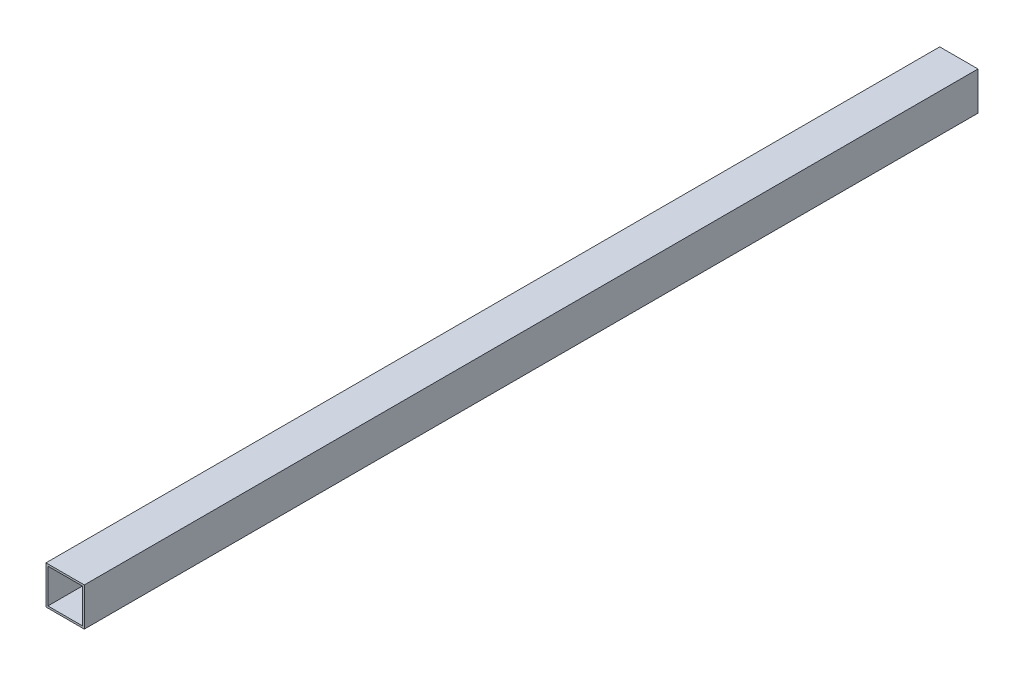
ISO-10303-21;
HEADER;
FILE_DESCRIPTION(('STEP AP214'),'2;1');
FILE_NAME('part.step','',(''),(''),'','','');
FILE_SCHEMA(('AUTOMOTIVE_DESIGN { 1 0 10303 214 1 1 1 1 }'));
ENDSEC;
DATA;
#1=APPLICATION_CONTEXT('core data for automotive mechanical design processes');
#2=APPLICATION_PROTOCOL_DEFINITION('international standard','automotive_design',2000,#1);
#3=PRODUCT_CONTEXT('',#1,'mechanical');
#4=PRODUCT('Part','Part','',(#3));
#5=PRODUCT_RELATED_PRODUCT_CATEGORY('part','',(#4));
#6=PRODUCT_DEFINITION_FORMATION('','',#4);
#7=PRODUCT_DEFINITION_CONTEXT('part definition',#1,'design');
#8=PRODUCT_DEFINITION('design','',#6,#7);
#9=PRODUCT_DEFINITION_SHAPE('','',#8);
#10=(LENGTH_UNIT() NAMED_UNIT(*) SI_UNIT(.MILLI.,.METRE.));
#11=(NAMED_UNIT(*) PLANE_ANGLE_UNIT() SI_UNIT($,.RADIAN.));
#12=(NAMED_UNIT(*) SI_UNIT($,.STERADIAN.) SOLID_ANGLE_UNIT());
#13=UNCERTAINTY_MEASURE_WITH_UNIT(LENGTH_MEASURE(1.E-05),#10,'distance_accuracy_value','');
#14=(GEOMETRIC_REPRESENTATION_CONTEXT(3) GLOBAL_UNCERTAINTY_ASSIGNED_CONTEXT((#13)) GLOBAL_UNIT_ASSIGNED_CONTEXT((#10,
#11,#12)) REPRESENTATION_CONTEXT('',''));
#15=CARTESIAN_POINT('',(0.,0.,0.));
#16=DIRECTION('',(0.,0.,1.));
#17=DIRECTION('',(1.,0.,0.));
#18=AXIS2_PLACEMENT_3D('',#15,#16,#17);
#19=CARTESIAN_POINT('',(0.,0.,1400.));
#20=DIRECTION('',(0.,0.,-1.));
#21=DIRECTION('',(-1.,0.,0.));
#22=AXIS2_PLACEMENT_3D('',#19,#20,#21);
#23=PLANE('',#22);
#24=DIRECTION('',(0.,1.,0.));
#25=VECTOR('',#24,1.);
#26=CARTESIAN_POINT('',(30.,-30.,1400.));
#27=LINE('',#26,#25);
#28=CARTESIAN_POINT('',(30.,-30.,1400.));
#29=VERTEX_POINT('',#28);
#30=CARTESIAN_POINT('',(30.,30.,1400.));
#31=VERTEX_POINT('',#30);
#32=EDGE_CURVE('E146',#29,#31,#27,.T.);
#33=ORIENTED_EDGE('',*,*,#32,.T.);
#34=DIRECTION('',(-1.,0.,0.));
#35=VECTOR('',#34,1.);
#36=CARTESIAN_POINT('',(-30.,30.,1400.));
#37=LINE('',#36,#35);
#38=CARTESIAN_POINT('',(-30.,30.,1400.));
#39=VERTEX_POINT('',#38);
#40=EDGE_CURVE('E149',#31,#39,#37,.T.);
#41=ORIENTED_EDGE('',*,*,#40,.T.);
#42=DIRECTION('',(0.,-1.,0.));
#43=VECTOR('',#42,1.);
#44=CARTESIAN_POINT('',(-30.,-30.,1400.));
#45=LINE('',#44,#43);
#46=CARTESIAN_POINT('',(-30.,-30.,1400.));
#47=VERTEX_POINT('',#46);
#48=EDGE_CURVE('E152',#39,#47,#45,.T.);
#49=ORIENTED_EDGE('',*,*,#48,.T.);
#50=DIRECTION('',(1.,0.,0.));
#51=VECTOR('',#50,1.);
#52=CARTESIAN_POINT('',(-30.,-30.,1400.));
#53=LINE('',#52,#51);
#54=EDGE_CURVE('E154',#47,#29,#53,.T.);
#55=ORIENTED_EDGE('',*,*,#54,.T.);
#56=EDGE_LOOP('',(#33,#41,#49,#55));
#57=FACE_BOUND('',#56,.T.);
#58=DIRECTION('',(0.,-1.,0.));
#59=VECTOR('',#58,1.);
#60=CARTESIAN_POINT('',(-27.,-27.,1400.));
#61=LINE('',#60,#59);
#62=CARTESIAN_POINT('',(-27.,27.,1400.));
#63=VERTEX_POINT('',#62);
#64=CARTESIAN_POINT('',(-27.,-27.,1400.));
#65=VERTEX_POINT('',#64);
#66=EDGE_CURVE('E107',#63,#65,#61,.T.);
#67=ORIENTED_EDGE('',*,*,#66,.F.);
#68=DIRECTION('',(-1.,0.,0.));
#69=VECTOR('',#68,1.);
#70=CARTESIAN_POINT('',(-27.,27.,1400.));
#71=LINE('',#70,#69);
#72=CARTESIAN_POINT('',(27.,27.,1400.));
#73=VERTEX_POINT('',#72);
#74=EDGE_CURVE('E129',#73,#63,#71,.T.);
#75=ORIENTED_EDGE('',*,*,#74,.F.);
#76=DIRECTION('',(0.,1.,0.));
#77=VECTOR('',#76,1.);
#78=CARTESIAN_POINT('',(27.,-27.,1400.));
#79=LINE('',#78,#77);
#80=CARTESIAN_POINT('',(27.,-27.,1400.));
#81=VERTEX_POINT('',#80);
#82=EDGE_CURVE('E127',#81,#73,#79,.T.);
#83=ORIENTED_EDGE('',*,*,#82,.F.);
#84=DIRECTION('',(1.,0.,0.));
#85=VECTOR('',#84,1.);
#86=CARTESIAN_POINT('',(-27.,-27.,1400.));
#87=LINE('',#86,#85);
#88=EDGE_CURVE('E115',#65,#81,#87,.T.);
#89=ORIENTED_EDGE('',*,*,#88,.F.);
#90=EDGE_LOOP('',(#67,#75,#83,#89));
#91=FACE_BOUND('',#90,.T.);
#92=ADVANCED_FACE('F39',(#57,#91),#23,.F.);
#93=CARTESIAN_POINT('',(0.,0.,0.));
#94=DIRECTION('',(0.,0.,-1.));
#95=DIRECTION('',(-1.,0.,0.));
#96=AXIS2_PLACEMENT_3D('',#93,#94,#95);
#97=PLANE('',#96);
#98=DIRECTION('',(0.,1.,0.));
#99=VECTOR('',#98,1.);
#100=CARTESIAN_POINT('',(30.,-30.,0.));
#101=LINE('',#100,#99);
#102=CARTESIAN_POINT('',(30.,-30.,0.));
#103=VERTEX_POINT('',#102);
#104=CARTESIAN_POINT('',(30.,30.,0.));
#105=VERTEX_POINT('',#104);
#106=EDGE_CURVE('E123',#103,#105,#101,.T.);
#107=ORIENTED_EDGE('',*,*,#106,.F.);
#108=DIRECTION('',(1.,0.,0.));
#109=VECTOR('',#108,1.);
#110=CARTESIAN_POINT('',(-30.,-30.,0.));
#111=LINE('',#110,#109);
#112=CARTESIAN_POINT('',(-30.,-30.,0.));
#113=VERTEX_POINT('',#112);
#114=EDGE_CURVE('E150',#113,#103,#111,.T.);
#115=ORIENTED_EDGE('',*,*,#114,.F.);
#116=DIRECTION('',(0.,-1.,0.));
#117=VECTOR('',#116,1.);
#118=CARTESIAN_POINT('',(-30.,-30.,0.));
#119=LINE('',#118,#117);
#120=CARTESIAN_POINT('',(-30.,30.,0.));
#121=VERTEX_POINT('',#120);
#122=EDGE_CURVE('E163',#121,#113,#119,.T.);
#123=ORIENTED_EDGE('',*,*,#122,.F.);
#124=DIRECTION('',(-1.,0.,0.));
#125=VECTOR('',#124,1.);
#126=CARTESIAN_POINT('',(-30.,30.,0.));
#127=LINE('',#126,#125);
#128=EDGE_CURVE('E160',#105,#121,#127,.T.);
#129=ORIENTED_EDGE('',*,*,#128,.F.);
#130=EDGE_LOOP('',(#107,#115,#123,#129));
#131=FACE_BOUND('',#130,.T.);
#132=DIRECTION('',(-1.,0.,0.));
#133=VECTOR('',#132,1.);
#134=CARTESIAN_POINT('',(-27.,27.,0.));
#135=LINE('',#134,#133);
#136=CARTESIAN_POINT('',(27.,27.,0.));
#137=VERTEX_POINT('',#136);
#138=CARTESIAN_POINT('',(-27.,27.,0.));
#139=VERTEX_POINT('',#138);
#140=EDGE_CURVE('E116',#137,#139,#135,.T.);
#141=ORIENTED_EDGE('',*,*,#140,.T.);
#142=DIRECTION('',(0.,-1.,0.));
#143=VECTOR('',#142,1.);
#144=CARTESIAN_POINT('',(-27.,-27.,0.));
#145=LINE('',#144,#143);
#146=CARTESIAN_POINT('',(-27.,-27.,0.));
#147=VERTEX_POINT('',#146);
#148=EDGE_CURVE('E63',#139,#147,#145,.T.);
#149=ORIENTED_EDGE('',*,*,#148,.T.);
#150=DIRECTION('',(1.,0.,0.));
#151=VECTOR('',#150,1.);
#152=CARTESIAN_POINT('',(-27.,-27.,0.));
#153=LINE('',#152,#151);
#154=CARTESIAN_POINT('',(27.,-27.,0.));
#155=VERTEX_POINT('',#154);
#156=EDGE_CURVE('E122',#147,#155,#153,.T.);
#157=ORIENTED_EDGE('',*,*,#156,.T.);
#158=DIRECTION('',(0.,1.,0.));
#159=VECTOR('',#158,1.);
#160=CARTESIAN_POINT('',(27.,-27.,0.));
#161=LINE('',#160,#159);
#162=EDGE_CURVE('E135',#155,#137,#161,.T.);
#163=ORIENTED_EDGE('',*,*,#162,.T.);
#164=EDGE_LOOP('',(#141,#149,#157,#163));
#165=FACE_BOUND('',#164,.T.);
#166=ADVANCED_FACE('F181',(#131,#165),#97,.T.);
#167=CARTESIAN_POINT('',(30.,-30.,1400.));
#168=DIRECTION('',(-1.,0.,0.));
#169=DIRECTION('',(0.,0.,1.));
#170=AXIS2_PLACEMENT_3D('',#167,#168,#169);
#171=PLANE('',#170);
#172=ORIENTED_EDGE('',*,*,#106,.T.);
#173=DIRECTION('',(0.,0.,-1.));
#174=VECTOR('',#173,1.);
#175=CARTESIAN_POINT('',(30.,30.,1400.));
#176=LINE('',#175,#174);
#177=EDGE_CURVE('E11',#31,#105,#176,.T.);
#178=ORIENTED_EDGE('',*,*,#177,.F.);
#179=ORIENTED_EDGE('',*,*,#32,.F.);
#180=DIRECTION('',(0.,0.,-1.));
#181=VECTOR('',#180,1.);
#182=CARTESIAN_POINT('',(30.,-30.,1400.));
#183=LINE('',#182,#181);
#184=EDGE_CURVE('E156',#29,#103,#183,.T.);
#185=ORIENTED_EDGE('',*,*,#184,.T.);
#186=EDGE_LOOP('',(#172,#178,#179,#185));
#187=FACE_BOUND('',#186,.T.);
#188=ADVANCED_FACE('F41',(#187),#171,.F.);
#189=CARTESIAN_POINT('',(-30.,30.,1400.));
#190=DIRECTION('',(0.,-1.,0.));
#191=DIRECTION('',(0.,0.,-1.));
#192=AXIS2_PLACEMENT_3D('',#189,#190,#191);
#193=PLANE('',#192);
#194=ORIENTED_EDGE('',*,*,#128,.T.);
#195=DIRECTION('',(0.,0.,-1.));
#196=VECTOR('',#195,1.);
#197=CARTESIAN_POINT('',(-30.,30.,1400.));
#198=LINE('',#197,#196);
#199=EDGE_CURVE('E48',#39,#121,#198,.T.);
#200=ORIENTED_EDGE('',*,*,#199,.F.);
#201=ORIENTED_EDGE('',*,*,#40,.F.);
#202=ORIENTED_EDGE('',*,*,#177,.T.);
#203=EDGE_LOOP('',(#194,#200,#201,#202));
#204=FACE_BOUND('',#203,.T.);
#205=ADVANCED_FACE('F191',(#204),#193,.F.);
#206=CARTESIAN_POINT('',(-30.,-30.,1400.));
#207=DIRECTION('',(1.,0.,0.));
#208=DIRECTION('',(0.,0.,-1.));
#209=AXIS2_PLACEMENT_3D('',#206,#207,#208);
#210=PLANE('',#209);
#211=ORIENTED_EDGE('',*,*,#122,.T.);
#212=DIRECTION('',(0.,0.,-1.));
#213=VECTOR('',#212,1.);
#214=CARTESIAN_POINT('',(-30.,-30.,1400.));
#215=LINE('',#214,#213);
#216=EDGE_CURVE('E168',#47,#113,#215,.T.);
#217=ORIENTED_EDGE('',*,*,#216,.F.);
#218=ORIENTED_EDGE('',*,*,#48,.F.);
#219=ORIENTED_EDGE('',*,*,#199,.T.);
#220=EDGE_LOOP('',(#211,#217,#218,#219));
#221=FACE_BOUND('',#220,.T.);
#222=ADVANCED_FACE('F175',(#221),#210,.F.);
#223=CARTESIAN_POINT('',(-30.,-30.,1400.));
#224=DIRECTION('',(0.,1.,0.));
#225=DIRECTION('',(0.,0.,1.));
#226=AXIS2_PLACEMENT_3D('',#223,#224,#225);
#227=PLANE('',#226);
#228=ORIENTED_EDGE('',*,*,#114,.T.);
#229=ORIENTED_EDGE('',*,*,#184,.F.);
#230=ORIENTED_EDGE('',*,*,#54,.F.);
#231=ORIENTED_EDGE('',*,*,#216,.T.);
#232=EDGE_LOOP('',(#228,#229,#230,#231));
#233=FACE_BOUND('',#232,.T.);
#234=ADVANCED_FACE('F185',(#233),#227,.F.);
#235=CARTESIAN_POINT('',(-27.,-27.,1400.));
#236=DIRECTION('',(1.,0.,0.));
#237=DIRECTION('',(0.,0.,-1.));
#238=AXIS2_PLACEMENT_3D('',#235,#236,#237);
#239=PLANE('',#238);
#240=ORIENTED_EDGE('',*,*,#148,.F.);
#241=DIRECTION('',(0.,0.,-1.));
#242=VECTOR('',#241,1.);
#243=CARTESIAN_POINT('',(-27.,27.,1400.));
#244=LINE('',#243,#242);
#245=EDGE_CURVE('E111',#63,#139,#244,.T.);
#246=ORIENTED_EDGE('',*,*,#245,.F.);
#247=ORIENTED_EDGE('',*,*,#66,.T.);
#248=DIRECTION('',(0.,0.,-1.));
#249=VECTOR('',#248,1.);
#250=CARTESIAN_POINT('',(-27.,-27.,1400.));
#251=LINE('',#250,#249);
#252=EDGE_CURVE('E110',#65,#147,#251,.T.);
#253=ORIENTED_EDGE('',*,*,#252,.T.);
#254=EDGE_LOOP('',(#240,#246,#247,#253));
#255=FACE_BOUND('',#254,.T.);
#256=ADVANCED_FACE('F109',(#255),#239,.T.);
#257=CARTESIAN_POINT('',(-27.,-27.,1400.));
#258=DIRECTION('',(0.,1.,0.));
#259=DIRECTION('',(0.,0.,1.));
#260=AXIS2_PLACEMENT_3D('',#257,#258,#259);
#261=PLANE('',#260);
#262=ORIENTED_EDGE('',*,*,#156,.F.);
#263=ORIENTED_EDGE('',*,*,#252,.F.);
#264=ORIENTED_EDGE('',*,*,#88,.T.);
#265=DIRECTION('',(0.,0.,-1.));
#266=VECTOR('',#265,1.);
#267=CARTESIAN_POINT('',(27.,-27.,1400.));
#268=LINE('',#267,#266);
#269=EDGE_CURVE('E124',#81,#155,#268,.T.);
#270=ORIENTED_EDGE('',*,*,#269,.T.);
#271=EDGE_LOOP('',(#262,#263,#264,#270));
#272=FACE_BOUND('',#271,.T.);
#273=ADVANCED_FACE('F119',(#272),#261,.T.);
#274=CARTESIAN_POINT('',(27.,-27.,1400.));
#275=DIRECTION('',(-1.,0.,0.));
#276=DIRECTION('',(0.,-1.,0.));
#277=AXIS2_PLACEMENT_3D('',#274,#275,#276);
#278=PLANE('',#277);
#279=ORIENTED_EDGE('',*,*,#162,.F.);
#280=ORIENTED_EDGE('',*,*,#269,.F.);
#281=ORIENTED_EDGE('',*,*,#82,.T.);
#282=DIRECTION('',(0.,0.,-1.));
#283=VECTOR('',#282,1.);
#284=CARTESIAN_POINT('',(27.,27.,1400.));
#285=LINE('',#284,#283);
#286=EDGE_CURVE('E55',#73,#137,#285,.T.);
#287=ORIENTED_EDGE('',*,*,#286,.T.);
#288=EDGE_LOOP('',(#279,#280,#281,#287));
#289=FACE_BOUND('',#288,.T.);
#290=ADVANCED_FACE('F214',(#289),#278,.T.);
#291=CARTESIAN_POINT('',(-27.,27.,1400.));
#292=DIRECTION('',(0.,-1.,0.));
#293=DIRECTION('',(0.,0.,-1.));
#294=AXIS2_PLACEMENT_3D('',#291,#292,#293);
#295=PLANE('',#294);
#296=ORIENTED_EDGE('',*,*,#140,.F.);
#297=ORIENTED_EDGE('',*,*,#286,.F.);
#298=ORIENTED_EDGE('',*,*,#74,.T.);
#299=ORIENTED_EDGE('',*,*,#245,.T.);
#300=EDGE_LOOP('',(#296,#297,#298,#299));
#301=FACE_BOUND('',#300,.T.);
#302=ADVANCED_FACE('F218',(#301),#295,.T.);
#303=CLOSED_SHELL('',(#92,#166,#188,#205,#222,#234,#256,#273,#290,#302));
#304=MANIFOLD_SOLID_BREP('B2',#303);
#305=ADVANCED_BREP_SHAPE_REPRESENTATION('',(#18,#304),#14);
#306=SHAPE_DEFINITION_REPRESENTATION(#9,#305);
ENDSEC;
END-ISO-10303-21;
